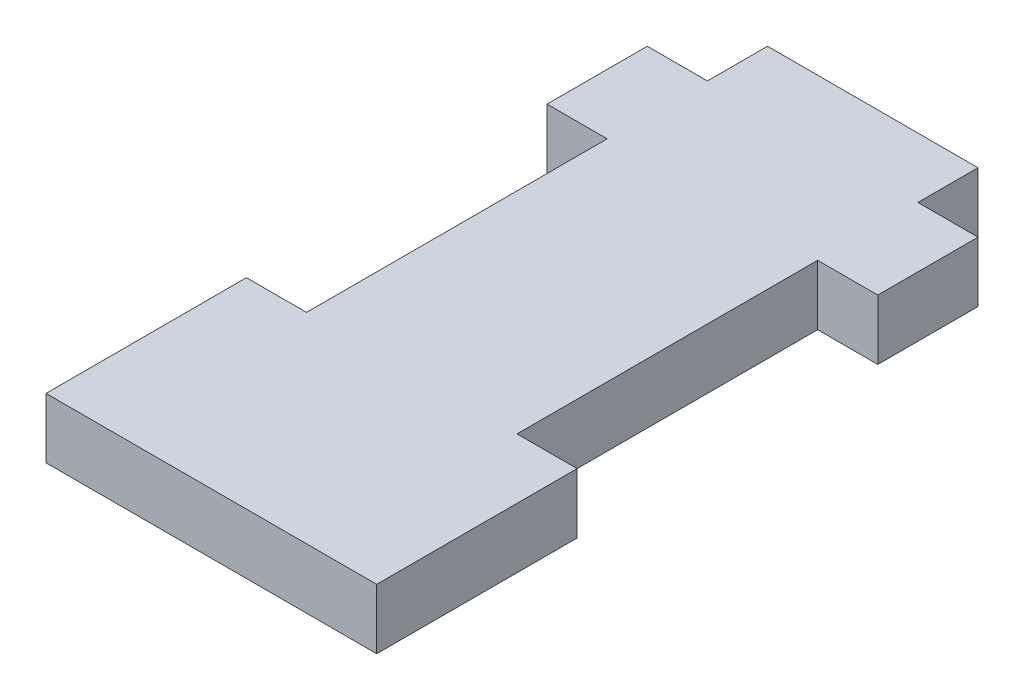
ISO-10303-21;
HEADER;
FILE_DESCRIPTION(('STEP AP214'),'2;1');
FILE_NAME('part.step','',(''),(''),'','','');
FILE_SCHEMA(('AUTOMOTIVE_DESIGN { 1 0 10303 214 1 1 1 1 }'));
ENDSEC;
DATA;
#1=APPLICATION_CONTEXT('core data for automotive mechanical design processes');
#2=APPLICATION_PROTOCOL_DEFINITION('international standard','automotive_design',2000,#1);
#3=PRODUCT_CONTEXT('',#1,'mechanical');
#4=PRODUCT('Part','Part','',(#3));
#5=PRODUCT_RELATED_PRODUCT_CATEGORY('part','',(#4));
#6=PRODUCT_DEFINITION_FORMATION('','',#4);
#7=PRODUCT_DEFINITION_CONTEXT('part definition',#1,'design');
#8=PRODUCT_DEFINITION('design','',#6,#7);
#9=PRODUCT_DEFINITION_SHAPE('','',#8);
#10=(LENGTH_UNIT() NAMED_UNIT(*) SI_UNIT(.MILLI.,.METRE.));
#11=(NAMED_UNIT(*) PLANE_ANGLE_UNIT() SI_UNIT($,.RADIAN.));
#12=(NAMED_UNIT(*) SI_UNIT($,.STERADIAN.) SOLID_ANGLE_UNIT());
#13=UNCERTAINTY_MEASURE_WITH_UNIT(LENGTH_MEASURE(1.E-05),#10,'distance_accuracy_value','');
#14=(GEOMETRIC_REPRESENTATION_CONTEXT(3) GLOBAL_UNCERTAINTY_ASSIGNED_CONTEXT((#13)) GLOBAL_UNIT_ASSIGNED_CONTEXT((#10,
#11,#12)) REPRESENTATION_CONTEXT('',''));
#15=CARTESIAN_POINT('',(0.,0.,0.));
#16=DIRECTION('',(0.,0.,1.));
#17=DIRECTION('',(1.,0.,0.));
#18=AXIS2_PLACEMENT_3D('',#15,#16,#17);
#19=CARTESIAN_POINT('',(10.5,3.,0.));
#20=DIRECTION('',(1.,0.,0.));
#21=DIRECTION('',(0.,0.,-1.));
#22=AXIS2_PLACEMENT_3D('',#19,#20,#21);
#23=PLANE('',#22);
#24=DIRECTION('',(0.,0.,1.));
#25=VECTOR('',#24,1.);
#26=CARTESIAN_POINT('',(10.5,0.,0.));
#27=LINE('',#26,#25);
#28=CARTESIAN_POINT('',(10.5,0.,22.));
#29=VERTEX_POINT('',#28);
#30=CARTESIAN_POINT('',(10.5,0.,25.));
#31=VERTEX_POINT('',#30);
#32=EDGE_CURVE('E185',#29,#31,#27,.T.);
#33=ORIENTED_EDGE('',*,*,#32,.F.);
#34=DIRECTION('',(0.,-1.,0.));
#35=VECTOR('',#34,1.);
#36=CARTESIAN_POINT('',(10.5,3.,22.));
#37=LINE('',#36,#35);
#38=CARTESIAN_POINT('',(10.5,3.,22.));
#39=VERTEX_POINT('',#38);
#40=EDGE_CURVE('E11',#39,#29,#37,.T.);
#41=ORIENTED_EDGE('',*,*,#40,.F.);
#42=DIRECTION('',(0.,0.,1.));
#43=VECTOR('',#42,1.);
#44=CARTESIAN_POINT('',(10.5,3.,0.));
#45=LINE('',#44,#43);
#46=CARTESIAN_POINT('',(10.5,3.,25.));
#47=VERTEX_POINT('',#46);
#48=EDGE_CURVE('E223',#39,#47,#45,.T.);
#49=ORIENTED_EDGE('',*,*,#48,.T.);
#50=DIRECTION('',(0.,-1.,0.));
#51=VECTOR('',#50,1.);
#52=CARTESIAN_POINT('',(10.5,3.,25.));
#53=LINE('',#52,#51);
#54=EDGE_CURVE('E60',#47,#31,#53,.T.);
#55=ORIENTED_EDGE('',*,*,#54,.T.);
#56=EDGE_LOOP('',(#33,#41,#49,#55));
#57=FACE_BOUND('',#56,.T.);
#58=ADVANCED_FACE('F43',(#57),#23,.T.);
#59=CARTESIAN_POINT('',(0.,3.,22.));
#60=DIRECTION('',(0.,0.,-1.));
#61=DIRECTION('',(-1.,0.,0.));
#62=AXIS2_PLACEMENT_3D('',#59,#60,#61);
#63=PLANE('',#62);
#64=DIRECTION('',(1.,0.,0.));
#65=VECTOR('',#64,1.);
#66=CARTESIAN_POINT('',(0.,0.,22.));
#67=LINE('',#66,#65);
#68=CARTESIAN_POINT('',(0.,0.,22.));
#69=VERTEX_POINT('',#68);
#70=EDGE_CURVE('E187',#69,#29,#67,.T.);
#71=ORIENTED_EDGE('',*,*,#70,.F.);
#72=DIRECTION('',(0.,-1.,0.));
#73=VECTOR('',#72,1.);
#74=CARTESIAN_POINT('',(0.,3.,22.));
#75=LINE('',#74,#73);
#76=CARTESIAN_POINT('',(0.,3.,22.));
#77=VERTEX_POINT('',#76);
#78=EDGE_CURVE('E52',#77,#69,#75,.T.);
#79=ORIENTED_EDGE('',*,*,#78,.F.);
#80=DIRECTION('',(1.,0.,0.));
#81=VECTOR('',#80,1.);
#82=CARTESIAN_POINT('',(0.,3.,22.));
#83=LINE('',#82,#81);
#84=EDGE_CURVE('E262',#77,#39,#83,.T.);
#85=ORIENTED_EDGE('',*,*,#84,.T.);
#86=ORIENTED_EDGE('',*,*,#40,.T.);
#87=EDGE_LOOP('',(#71,#79,#85,#86));
#88=FACE_BOUND('',#87,.T.);
#89=ADVANCED_FACE('F45',(#88),#63,.T.);
#90=CARTESIAN_POINT('',(0.,3.,0.));
#91=DIRECTION('',(1.,0.,0.));
#92=DIRECTION('',(0.,0.,-1.));
#93=AXIS2_PLACEMENT_3D('',#90,#91,#92);
#94=PLANE('',#93);
#95=DIRECTION('',(0.,0.,1.));
#96=VECTOR('',#95,1.);
#97=CARTESIAN_POINT('',(0.,0.,0.));
#98=LINE('',#97,#96);
#99=CARTESIAN_POINT('',(0.,0.,25.));
#100=VERTEX_POINT('',#99);
#101=EDGE_CURVE('E191',#69,#100,#98,.T.);
#102=ORIENTED_EDGE('',*,*,#101,.T.);
#103=DIRECTION('',(0.,-1.,0.));
#104=VECTOR('',#103,1.);
#105=CARTESIAN_POINT('',(0.,3.,25.));
#106=LINE('',#105,#104);
#107=CARTESIAN_POINT('',(0.,3.,25.));
#108=VERTEX_POINT('',#107);
#109=EDGE_CURVE('E247',#108,#100,#106,.T.);
#110=ORIENTED_EDGE('',*,*,#109,.F.);
#111=DIRECTION('',(0.,0.,1.));
#112=VECTOR('',#111,1.);
#113=CARTESIAN_POINT('',(0.,3.,0.));
#114=LINE('',#113,#112);
#115=EDGE_CURVE('E254',#77,#108,#114,.T.);
#116=ORIENTED_EDGE('',*,*,#115,.F.);
#117=ORIENTED_EDGE('',*,*,#78,.T.);
#118=EDGE_LOOP('',(#102,#110,#116,#117));
#119=FACE_BOUND('',#118,.T.);
#120=ADVANCED_FACE('F252',(#119),#94,.F.);
#121=CARTESIAN_POINT('',(0.,3.,25.));
#122=DIRECTION('',(0.,0.,1.));
#123=DIRECTION('',(1.,0.,0.));
#124=AXIS2_PLACEMENT_3D('',#121,#122,#123);
#125=PLANE('',#124);
#126=DIRECTION('',(-1.,0.,0.));
#127=VECTOR('',#126,1.);
#128=CARTESIAN_POINT('',(0.,0.,25.));
#129=LINE('',#128,#127);
#130=CARTESIAN_POINT('',(-3.00000000000001,0.,25.));
#131=VERTEX_POINT('',#130);
#132=EDGE_CURVE('E193',#100,#131,#129,.T.);
#133=ORIENTED_EDGE('',*,*,#132,.T.);
#134=DIRECTION('',(0.,-1.,0.));
#135=VECTOR('',#134,1.);
#136=CARTESIAN_POINT('',(-3.00000000000001,3.,25.));
#137=LINE('',#136,#135);
#138=CARTESIAN_POINT('',(-3.00000000000001,3.,25.));
#139=VERTEX_POINT('',#138);
#140=EDGE_CURVE('E245',#139,#131,#137,.T.);
#141=ORIENTED_EDGE('',*,*,#140,.F.);
#142=DIRECTION('',(-1.,0.,0.));
#143=VECTOR('',#142,1.);
#144=CARTESIAN_POINT('',(0.,3.,25.));
#145=LINE('',#144,#143);
#146=EDGE_CURVE('E337',#108,#139,#145,.T.);
#147=ORIENTED_EDGE('',*,*,#146,.F.);
#148=ORIENTED_EDGE('',*,*,#109,.T.);
#149=EDGE_LOOP('',(#133,#141,#147,#148));
#150=FACE_BOUND('',#149,.T.);
#151=ADVANCED_FACE('F336',(#150),#125,.F.);
#152=CARTESIAN_POINT('',(-3.00000000000001,3.,0.));
#153=DIRECTION('',(-1.,0.,0.));
#154=DIRECTION('',(0.,0.,1.));
#155=AXIS2_PLACEMENT_3D('',#152,#153,#154);
#156=PLANE('',#155);
#157=DIRECTION('',(0.,0.,-1.));
#158=VECTOR('',#157,1.);
#159=CARTESIAN_POINT('',(-3.00000000000001,0.,0.));
#160=LINE('',#159,#158);
#161=CARTESIAN_POINT('',(-3.00000000000001,0.,30.));
#162=VERTEX_POINT('',#161);
#163=EDGE_CURVE('E197',#162,#131,#160,.T.);
#164=ORIENTED_EDGE('',*,*,#163,.F.);
#165=DIRECTION('',(0.,-1.,0.));
#166=VECTOR('',#165,1.);
#167=CARTESIAN_POINT('',(-3.00000000000001,3.,30.));
#168=LINE('',#167,#166);
#169=CARTESIAN_POINT('',(-3.00000000000001,3.,30.));
#170=VERTEX_POINT('',#169);
#171=EDGE_CURVE('E243',#170,#162,#168,.T.);
#172=ORIENTED_EDGE('',*,*,#171,.F.);
#173=DIRECTION('',(0.,0.,-1.));
#174=VECTOR('',#173,1.);
#175=CARTESIAN_POINT('',(-3.00000000000001,3.,0.));
#176=LINE('',#175,#174);
#177=EDGE_CURVE('E333',#170,#139,#176,.T.);
#178=ORIENTED_EDGE('',*,*,#177,.T.);
#179=ORIENTED_EDGE('',*,*,#140,.T.);
#180=EDGE_LOOP('',(#164,#172,#178,#179));
#181=FACE_BOUND('',#180,.T.);
#182=ADVANCED_FACE('F331',(#181),#156,.T.);
#183=CARTESIAN_POINT('',(0.,3.,30.));
#184=DIRECTION('',(0.,0.,1.));
#185=DIRECTION('',(1.,0.,0.));
#186=AXIS2_PLACEMENT_3D('',#183,#184,#185);
#187=PLANE('',#186);
#188=DIRECTION('',(-1.,0.,0.));
#189=VECTOR('',#188,1.);
#190=CARTESIAN_POINT('',(0.,0.,30.));
#191=LINE('',#190,#189);
#192=CARTESIAN_POINT('',(0.,0.,30.));
#193=VERTEX_POINT('',#192);
#194=EDGE_CURVE('E200',#193,#162,#191,.T.);
#195=ORIENTED_EDGE('',*,*,#194,.F.);
#196=DIRECTION('',(0.,-1.,0.));
#197=VECTOR('',#196,1.);
#198=CARTESIAN_POINT('',(0.,3.,30.));
#199=LINE('',#198,#197);
#200=CARTESIAN_POINT('',(0.,3.,30.));
#201=VERTEX_POINT('',#200);
#202=EDGE_CURVE('E241',#201,#193,#199,.T.);
#203=ORIENTED_EDGE('',*,*,#202,.F.);
#204=DIRECTION('',(-1.,0.,0.));
#205=VECTOR('',#204,1.);
#206=CARTESIAN_POINT('',(0.,3.,30.));
#207=LINE('',#206,#205);
#208=EDGE_CURVE('E327',#201,#170,#207,.T.);
#209=ORIENTED_EDGE('',*,*,#208,.T.);
#210=ORIENTED_EDGE('',*,*,#171,.T.);
#211=EDGE_LOOP('',(#195,#203,#209,#210));
#212=FACE_BOUND('',#211,.T.);
#213=ADVANCED_FACE('F322',(#212),#187,.T.);
#214=CARTESIAN_POINT('',(0.,0.,45.));
#215=VERTEX_POINT('',#214);
#216=EDGE_CURVE('E194',#193,#215,#98,.T.);
#217=ORIENTED_EDGE('',*,*,#216,.T.);
#218=DIRECTION('',(0.,-1.,0.));
#219=VECTOR('',#218,1.);
#220=CARTESIAN_POINT('',(0.,3.,45.));
#221=LINE('',#220,#219);
#222=CARTESIAN_POINT('',(0.,3.,45.));
#223=VERTEX_POINT('',#222);
#224=EDGE_CURVE('E238',#223,#215,#221,.T.);
#225=ORIENTED_EDGE('',*,*,#224,.F.);
#226=EDGE_CURVE('E341',#201,#223,#114,.T.);
#227=ORIENTED_EDGE('',*,*,#226,.F.);
#228=ORIENTED_EDGE('',*,*,#202,.T.);
#229=EDGE_LOOP('',(#217,#225,#227,#228));
#230=FACE_BOUND('',#229,.T.);
#231=ADVANCED_FACE('F350',(#230),#94,.F.);
#232=CARTESIAN_POINT('',(0.,3.,45.));
#233=DIRECTION('',(0.,0.,1.));
#234=DIRECTION('',(1.,0.,0.));
#235=AXIS2_PLACEMENT_3D('',#232,#233,#234);
#236=PLANE('',#235);
#237=DIRECTION('',(-1.,0.,0.));
#238=VECTOR('',#237,1.);
#239=CARTESIAN_POINT('',(0.,0.,45.));
#240=LINE('',#239,#238);
#241=CARTESIAN_POINT('',(-3.,0.,45.));
#242=VERTEX_POINT('',#241);
#243=EDGE_CURVE('E203',#215,#242,#240,.T.);
#244=ORIENTED_EDGE('',*,*,#243,.T.);
#245=DIRECTION('',(0.,-1.,0.));
#246=VECTOR('',#245,1.);
#247=CARTESIAN_POINT('',(-3.,3.,45.));
#248=LINE('',#247,#246);
#249=CARTESIAN_POINT('',(-3.,3.,45.));
#250=VERTEX_POINT('',#249);
#251=EDGE_CURVE('E236',#250,#242,#248,.T.);
#252=ORIENTED_EDGE('',*,*,#251,.F.);
#253=DIRECTION('',(-1.,0.,0.));
#254=VECTOR('',#253,1.);
#255=CARTESIAN_POINT('',(0.,3.,45.));
#256=LINE('',#255,#254);
#257=EDGE_CURVE('E345',#223,#250,#256,.T.);
#258=ORIENTED_EDGE('',*,*,#257,.F.);
#259=ORIENTED_EDGE('',*,*,#224,.T.);
#260=EDGE_LOOP('',(#244,#252,#258,#259));
#261=FACE_BOUND('',#260,.T.);
#262=ADVANCED_FACE('F316',(#261),#236,.F.);
#263=CARTESIAN_POINT('',(-3.,3.,0.));
#264=DIRECTION('',(-1.,0.,0.));
#265=DIRECTION('',(0.,0.,1.));
#266=AXIS2_PLACEMENT_3D('',#263,#264,#265);
#267=PLANE('',#266);
#268=DIRECTION('',(0.,0.,-1.));
#269=VECTOR('',#268,1.);
#270=CARTESIAN_POINT('',(-3.,0.,0.));
#271=LINE('',#270,#269);
#272=CARTESIAN_POINT('',(-3.,0.,55.));
#273=VERTEX_POINT('',#272);
#274=EDGE_CURVE('E206',#273,#242,#271,.T.);
#275=ORIENTED_EDGE('',*,*,#274,.F.);
#276=DIRECTION('',(0.,-1.,0.));
#277=VECTOR('',#276,1.);
#278=CARTESIAN_POINT('',(-3.,3.,55.));
#279=LINE('',#278,#277);
#280=CARTESIAN_POINT('',(-3.,3.,55.));
#281=VERTEX_POINT('',#280);
#282=EDGE_CURVE('E234',#281,#273,#279,.T.);
#283=ORIENTED_EDGE('',*,*,#282,.F.);
#284=DIRECTION('',(0.,0.,-1.));
#285=VECTOR('',#284,1.);
#286=CARTESIAN_POINT('',(-3.,3.,0.));
#287=LINE('',#286,#285);
#288=EDGE_CURVE('E313',#281,#250,#287,.T.);
#289=ORIENTED_EDGE('',*,*,#288,.T.);
#290=ORIENTED_EDGE('',*,*,#251,.T.);
#291=EDGE_LOOP('',(#275,#283,#289,#290));
#292=FACE_BOUND('',#291,.T.);
#293=ADVANCED_FACE('F310',(#292),#267,.T.);
#294=CARTESIAN_POINT('',(0.,3.,55.));
#295=DIRECTION('',(0.,0.,-1.));
#296=DIRECTION('',(-1.,0.,0.));
#297=AXIS2_PLACEMENT_3D('',#294,#295,#296);
#298=PLANE('',#297);
#299=DIRECTION('',(1.,0.,0.));
#300=VECTOR('',#299,1.);
#301=CARTESIAN_POINT('',(0.,0.,55.));
#302=LINE('',#301,#300);
#303=CARTESIAN_POINT('',(13.5,0.,55.));
#304=VERTEX_POINT('',#303);
#305=EDGE_CURVE('E209',#273,#304,#302,.T.);
#306=ORIENTED_EDGE('',*,*,#305,.T.);
#307=DIRECTION('',(0.,-1.,0.));
#308=VECTOR('',#307,1.);
#309=CARTESIAN_POINT('',(13.5,3.,55.));
#310=LINE('',#309,#308);
#311=CARTESIAN_POINT('',(13.5,3.,55.));
#312=VERTEX_POINT('',#311);
#313=EDGE_CURVE('E231',#312,#304,#310,.T.);
#314=ORIENTED_EDGE('',*,*,#313,.F.);
#315=DIRECTION('',(1.,0.,0.));
#316=VECTOR('',#315,1.);
#317=CARTESIAN_POINT('',(0.,3.,55.));
#318=LINE('',#317,#316);
#319=EDGE_CURVE('E305',#281,#312,#318,.T.);
#320=ORIENTED_EDGE('',*,*,#319,.F.);
#321=ORIENTED_EDGE('',*,*,#282,.T.);
#322=EDGE_LOOP('',(#306,#314,#320,#321));
#323=FACE_BOUND('',#322,.T.);
#324=ADVANCED_FACE('F304',(#323),#298,.F.);
#325=CARTESIAN_POINT('',(13.5,3.,0.));
#326=DIRECTION('',(-1.,0.,0.));
#327=DIRECTION('',(0.,0.,1.));
#328=AXIS2_PLACEMENT_3D('',#325,#326,#327);
#329=PLANE('',#328);
#330=DIRECTION('',(0.,0.,-1.));
#331=VECTOR('',#330,1.);
#332=CARTESIAN_POINT('',(13.5,0.,0.));
#333=LINE('',#332,#331);
#334=CARTESIAN_POINT('',(13.5,0.,45.));
#335=VERTEX_POINT('',#334);
#336=EDGE_CURVE('E211',#304,#335,#333,.T.);
#337=ORIENTED_EDGE('',*,*,#336,.T.);
#338=DIRECTION('',(0.,-1.,0.));
#339=VECTOR('',#338,1.);
#340=CARTESIAN_POINT('',(13.5,3.,45.));
#341=LINE('',#340,#339);
#342=CARTESIAN_POINT('',(13.5,3.,45.));
#343=VERTEX_POINT('',#342);
#344=EDGE_CURVE('E229',#343,#335,#341,.T.);
#345=ORIENTED_EDGE('',*,*,#344,.F.);
#346=DIRECTION('',(0.,0.,-1.));
#347=VECTOR('',#346,1.);
#348=CARTESIAN_POINT('',(13.5,3.,0.));
#349=LINE('',#348,#347);
#350=EDGE_CURVE('E301',#312,#343,#349,.T.);
#351=ORIENTED_EDGE('',*,*,#350,.F.);
#352=ORIENTED_EDGE('',*,*,#313,.T.);
#353=EDGE_LOOP('',(#337,#345,#351,#352));
#354=FACE_BOUND('',#353,.T.);
#355=ADVANCED_FACE('F288',(#354),#329,.F.);
#356=CARTESIAN_POINT('',(0.,3.,45.));
#357=DIRECTION('',(0.,0.,-1.));
#358=DIRECTION('',(-1.,0.,0.));
#359=AXIS2_PLACEMENT_3D('',#356,#357,#358);
#360=PLANE('',#359);
#361=DIRECTION('',(1.,0.,0.));
#362=VECTOR('',#361,1.);
#363=CARTESIAN_POINT('',(0.,0.,45.));
#364=LINE('',#363,#362);
#365=CARTESIAN_POINT('',(10.5,0.,45.));
#366=VERTEX_POINT('',#365);
#367=EDGE_CURVE('E214',#366,#335,#364,.T.);
#368=ORIENTED_EDGE('',*,*,#367,.F.);
#369=DIRECTION('',(0.,-1.,0.));
#370=VECTOR('',#369,1.);
#371=CARTESIAN_POINT('',(10.5,3.,45.));
#372=LINE('',#371,#370);
#373=CARTESIAN_POINT('',(10.5,3.,45.));
#374=VERTEX_POINT('',#373);
#375=EDGE_CURVE('E227',#374,#366,#372,.T.);
#376=ORIENTED_EDGE('',*,*,#375,.F.);
#377=DIRECTION('',(1.,0.,0.));
#378=VECTOR('',#377,1.);
#379=CARTESIAN_POINT('',(0.,3.,45.));
#380=LINE('',#379,#378);
#381=EDGE_CURVE('E297',#374,#343,#380,.T.);
#382=ORIENTED_EDGE('',*,*,#381,.T.);
#383=ORIENTED_EDGE('',*,*,#344,.T.);
#384=EDGE_LOOP('',(#368,#376,#382,#383));
#385=FACE_BOUND('',#384,.T.);
#386=ADVANCED_FACE('F282',(#385),#360,.T.);
#387=CARTESIAN_POINT('',(10.5,0.,30.));
#388=VERTEX_POINT('',#387);
#389=EDGE_CURVE('E188',#388,#366,#27,.T.);
#390=ORIENTED_EDGE('',*,*,#389,.F.);
#391=DIRECTION('',(0.,-1.,0.));
#392=VECTOR('',#391,1.);
#393=CARTESIAN_POINT('',(10.5,3.,30.));
#394=LINE('',#393,#392);
#395=CARTESIAN_POINT('',(10.5,3.,30.));
#396=VERTEX_POINT('',#395);
#397=EDGE_CURVE('E177',#396,#388,#394,.T.);
#398=ORIENTED_EDGE('',*,*,#397,.F.);
#399=EDGE_CURVE('E167',#396,#374,#45,.T.);
#400=ORIENTED_EDGE('',*,*,#399,.T.);
#401=ORIENTED_EDGE('',*,*,#375,.T.);
#402=EDGE_LOOP('',(#390,#398,#400,#401));
#403=FACE_BOUND('',#402,.T.);
#404=ADVANCED_FACE('F275',(#403),#23,.T.);
#405=CARTESIAN_POINT('',(0.,3.,30.));
#406=DIRECTION('',(0.,0.,-1.));
#407=DIRECTION('',(-1.,0.,0.));
#408=AXIS2_PLACEMENT_3D('',#405,#406,#407);
#409=PLANE('',#408);
#410=DIRECTION('',(1.,0.,0.));
#411=VECTOR('',#410,1.);
#412=CARTESIAN_POINT('',(0.,0.,30.));
#413=LINE('',#412,#411);
#414=CARTESIAN_POINT('',(13.5,0.,30.));
#415=VERTEX_POINT('',#414);
#416=EDGE_CURVE('E174',#388,#415,#413,.T.);
#417=ORIENTED_EDGE('',*,*,#416,.T.);
#418=DIRECTION('',(0.,-1.,0.));
#419=VECTOR('',#418,1.);
#420=CARTESIAN_POINT('',(13.5,3.,30.));
#421=LINE('',#420,#419);
#422=CARTESIAN_POINT('',(13.5,3.,30.));
#423=VERTEX_POINT('',#422);
#424=EDGE_CURVE('E171',#423,#415,#421,.T.);
#425=ORIENTED_EDGE('',*,*,#424,.F.);
#426=DIRECTION('',(1.,0.,0.));
#427=VECTOR('',#426,1.);
#428=CARTESIAN_POINT('',(0.,3.,30.));
#429=LINE('',#428,#427);
#430=EDGE_CURVE('E159',#396,#423,#429,.T.);
#431=ORIENTED_EDGE('',*,*,#430,.F.);
#432=ORIENTED_EDGE('',*,*,#397,.T.);
#433=EDGE_LOOP('',(#417,#425,#431,#432));
#434=FACE_BOUND('',#433,.T.);
#435=ADVANCED_FACE('F172',(#434),#409,.F.);
#436=CARTESIAN_POINT('',(13.5,3.,0.));
#437=DIRECTION('',(-1.,0.,0.));
#438=DIRECTION('',(0.,0.,1.));
#439=AXIS2_PLACEMENT_3D('',#436,#437,#438);
#440=PLANE('',#439);
#441=DIRECTION('',(0.,0.,-1.));
#442=VECTOR('',#441,1.);
#443=CARTESIAN_POINT('',(13.5,0.,0.));
#444=LINE('',#443,#442);
#445=CARTESIAN_POINT('',(13.5,0.,25.));
#446=VERTEX_POINT('',#445);
#447=EDGE_CURVE('E218',#415,#446,#444,.T.);
#448=ORIENTED_EDGE('',*,*,#447,.T.);
#449=DIRECTION('',(0.,-1.,0.));
#450=VECTOR('',#449,1.);
#451=CARTESIAN_POINT('',(13.5,3.,25.));
#452=LINE('',#451,#450);
#453=CARTESIAN_POINT('',(13.5,3.,25.));
#454=VERTEX_POINT('',#453);
#455=EDGE_CURVE('E110',#454,#446,#452,.T.);
#456=ORIENTED_EDGE('',*,*,#455,.F.);
#457=DIRECTION('',(0.,0.,-1.));
#458=VECTOR('',#457,1.);
#459=CARTESIAN_POINT('',(13.5,3.,0.));
#460=LINE('',#459,#458);
#461=EDGE_CURVE('E164',#423,#454,#460,.T.);
#462=ORIENTED_EDGE('',*,*,#461,.F.);
#463=ORIENTED_EDGE('',*,*,#424,.T.);
#464=EDGE_LOOP('',(#448,#456,#462,#463));
#465=FACE_BOUND('',#464,.T.);
#466=ADVANCED_FACE('F179',(#465),#440,.F.);
#467=CARTESIAN_POINT('',(0.,3.,25.));
#468=DIRECTION('',(0.,0.,-1.));
#469=DIRECTION('',(-1.,0.,0.));
#470=AXIS2_PLACEMENT_3D('',#467,#468,#469);
#471=PLANE('',#470);
#472=DIRECTION('',(1.,0.,0.));
#473=VECTOR('',#472,1.);
#474=CARTESIAN_POINT('',(0.,0.,25.));
#475=LINE('',#474,#473);
#476=EDGE_CURVE('E220',#31,#446,#475,.T.);
#477=ORIENTED_EDGE('',*,*,#476,.F.);
#478=ORIENTED_EDGE('',*,*,#54,.F.);
#479=DIRECTION('',(1.,0.,0.));
#480=VECTOR('',#479,1.);
#481=CARTESIAN_POINT('',(0.,3.,25.));
#482=LINE('',#481,#480);
#483=EDGE_CURVE('E180',#47,#454,#482,.T.);
#484=ORIENTED_EDGE('',*,*,#483,.T.);
#485=ORIENTED_EDGE('',*,*,#455,.T.);
#486=EDGE_LOOP('',(#477,#478,#484,#485));
#487=FACE_BOUND('',#486,.T.);
#488=ADVANCED_FACE('F263',(#487),#471,.T.);
#489=CARTESIAN_POINT('',(0.,3.,0.));
#490=DIRECTION('',(0.,1.,0.));
#491=DIRECTION('',(0.,0.,1.));
#492=AXIS2_PLACEMENT_3D('',#489,#490,#491);
#493=PLANE('',#492);
#494=ORIENTED_EDGE('',*,*,#48,.F.);
#495=ORIENTED_EDGE('',*,*,#84,.F.);
#496=ORIENTED_EDGE('',*,*,#115,.T.);
#497=ORIENTED_EDGE('',*,*,#146,.T.);
#498=ORIENTED_EDGE('',*,*,#177,.F.);
#499=ORIENTED_EDGE('',*,*,#208,.F.);
#500=ORIENTED_EDGE('',*,*,#226,.T.);
#501=ORIENTED_EDGE('',*,*,#257,.T.);
#502=ORIENTED_EDGE('',*,*,#288,.F.);
#503=ORIENTED_EDGE('',*,*,#319,.T.);
#504=ORIENTED_EDGE('',*,*,#350,.T.);
#505=ORIENTED_EDGE('',*,*,#381,.F.);
#506=ORIENTED_EDGE('',*,*,#399,.F.);
#507=ORIENTED_EDGE('',*,*,#430,.T.);
#508=ORIENTED_EDGE('',*,*,#461,.T.);
#509=ORIENTED_EDGE('',*,*,#483,.F.);
#510=EDGE_LOOP('',(#494,#495,#496,#497,#498,#499,#500,#501,#502,#503,#504,#505,#506,#507,#508,#509));
#511=FACE_BOUND('',#510,.T.);
#512=ADVANCED_FACE('F161',(#511),#493,.T.);
#513=CARTESIAN_POINT('',(0.,0.,0.));
#514=DIRECTION('',(0.,1.,0.));
#515=DIRECTION('',(0.,0.,1.));
#516=AXIS2_PLACEMENT_3D('',#513,#514,#515);
#517=PLANE('',#516);
#518=ORIENTED_EDGE('',*,*,#32,.T.);
#519=ORIENTED_EDGE('',*,*,#476,.T.);
#520=ORIENTED_EDGE('',*,*,#447,.F.);
#521=ORIENTED_EDGE('',*,*,#416,.F.);
#522=ORIENTED_EDGE('',*,*,#389,.T.);
#523=ORIENTED_EDGE('',*,*,#367,.T.);
#524=ORIENTED_EDGE('',*,*,#336,.F.);
#525=ORIENTED_EDGE('',*,*,#305,.F.);
#526=ORIENTED_EDGE('',*,*,#274,.T.);
#527=ORIENTED_EDGE('',*,*,#243,.F.);
#528=ORIENTED_EDGE('',*,*,#216,.F.);
#529=ORIENTED_EDGE('',*,*,#194,.T.);
#530=ORIENTED_EDGE('',*,*,#163,.T.);
#531=ORIENTED_EDGE('',*,*,#132,.F.);
#532=ORIENTED_EDGE('',*,*,#101,.F.);
#533=ORIENTED_EDGE('',*,*,#70,.T.);
#534=EDGE_LOOP('',(#518,#519,#520,#521,#522,#523,#524,#525,#526,#527,#528,#529,#530,#531,#532,#533));
#535=FACE_BOUND('',#534,.T.);
#536=ADVANCED_FACE('F261',(#535),#517,.F.);
#537=CLOSED_SHELL('',(#58,#89,#120,#151,#182,#213,#231,#262,#293,#324,#355,#386,#404,#435,#466,
#488,#512,#536));
#538=MANIFOLD_SOLID_BREP('B2',#537);
#539=ADVANCED_BREP_SHAPE_REPRESENTATION('',(#18,#538),#14);
#540=SHAPE_DEFINITION_REPRESENTATION(#9,#539);
ENDSEC;
END-ISO-10303-21;
